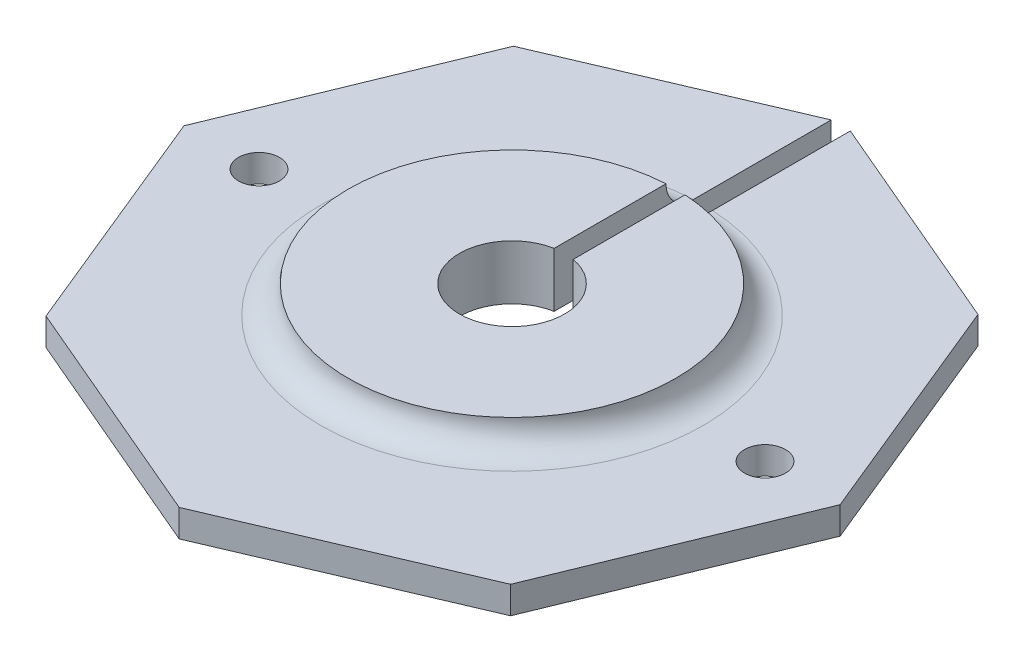
ISO-10303-21;
HEADER;
FILE_DESCRIPTION(('STEP AP214'),'2;1');
FILE_NAME('part.step','',(''),(''),'','','');
FILE_SCHEMA(('AUTOMOTIVE_DESIGN { 1 0 10303 214 1 1 1 1 }'));
ENDSEC;
DATA;
#1=APPLICATION_CONTEXT('core data for automotive mechanical design processes');
#2=APPLICATION_PROTOCOL_DEFINITION('international standard','automotive_design',2000,#1);
#3=PRODUCT_CONTEXT('',#1,'mechanical');
#4=PRODUCT('Part','Part','',(#3));
#5=PRODUCT_RELATED_PRODUCT_CATEGORY('part','',(#4));
#6=PRODUCT_DEFINITION_FORMATION('','',#4);
#7=PRODUCT_DEFINITION_CONTEXT('part definition',#1,'design');
#8=PRODUCT_DEFINITION('design','',#6,#7);
#9=PRODUCT_DEFINITION_SHAPE('','',#8);
#10=(LENGTH_UNIT() NAMED_UNIT(*) SI_UNIT(.MILLI.,.METRE.));
#11=(NAMED_UNIT(*) PLANE_ANGLE_UNIT() SI_UNIT($,.RADIAN.));
#12=(NAMED_UNIT(*) SI_UNIT($,.STERADIAN.) SOLID_ANGLE_UNIT());
#13=UNCERTAINTY_MEASURE_WITH_UNIT(LENGTH_MEASURE(1.E-05),#10,'distance_accuracy_value','');
#14=(GEOMETRIC_REPRESENTATION_CONTEXT(3) GLOBAL_UNCERTAINTY_ASSIGNED_CONTEXT((#13)) GLOBAL_UNIT_ASSIGNED_CONTEXT((#10,
#11,#12)) REPRESENTATION_CONTEXT('',''));
#15=CARTESIAN_POINT('',(0.,0.,0.));
#16=DIRECTION('',(0.,0.,1.));
#17=DIRECTION('',(1.,0.,0.));
#18=AXIS2_PLACEMENT_3D('',#15,#16,#17);
#19=CARTESIAN_POINT('',(17.0154623051134,2.,17.1176203244253));
#20=DIRECTION('',(-0.925276774293261,0.,-0.379292619165543));
#21=DIRECTION('',(-0.379292619165543,0.,0.925276774293261));
#22=AXIS2_PLACEMENT_3D('',#19,#20,#21);
#23=PLANE('',#22);
#24=DIRECTION('',(0.379292619165543,0.,-0.925276774293261));
#25=VECTOR('',#24,1.);
#26=CARTESIAN_POINT('',(17.0154623051134,0.,17.1176203244253));
#27=LINE('',#26,#25);
#28=CARTESIAN_POINT('',(17.0154623051134,0.,17.1176203244253));
#29=VERTEX_POINT('',#28);
#30=CARTESIAN_POINT('',(24.032375759676,0.,0.));
#31=VERTEX_POINT('',#30);
#32=EDGE_CURVE('E264',#29,#31,#27,.T.);
#33=ORIENTED_EDGE('',*,*,#32,.T.);
#34=DIRECTION('',(0.,-1.,0.));
#35=VECTOR('',#34,1.);
#36=CARTESIAN_POINT('',(24.032375759676,2.,0.));
#37=LINE('',#36,#35);
#38=CARTESIAN_POINT('',(24.032375759676,2.,0.));
#39=VERTEX_POINT('',#38);
#40=EDGE_CURVE('E196',#39,#31,#37,.T.);
#41=ORIENTED_EDGE('',*,*,#40,.F.);
#42=DIRECTION('',(0.379292619165543,0.,-0.925276774293261));
#43=VECTOR('',#42,1.);
#44=CARTESIAN_POINT('',(17.0154623051134,2.,17.1176203244253));
#45=LINE('',#44,#43);
#46=CARTESIAN_POINT('',(17.0154623051134,2.,17.1176203244253));
#47=VERTEX_POINT('',#46);
#48=EDGE_CURVE('E177',#47,#39,#45,.T.);
#49=ORIENTED_EDGE('',*,*,#48,.F.);
#50=DIRECTION('',(0.,-1.,0.));
#51=VECTOR('',#50,1.);
#52=CARTESIAN_POINT('',(17.0154623051134,2.,17.1176203244253));
#53=LINE('',#52,#51);
#54=EDGE_CURVE('E178',#47,#29,#53,.T.);
#55=ORIENTED_EDGE('',*,*,#54,.T.);
#56=EDGE_LOOP('',(#33,#41,#49,#55));
#57=FACE_BOUND('',#56,.T.);
#58=ADVANCED_FACE('F37',(#57),#23,.F.);
#59=CARTESIAN_POINT('',(24.032375759676,2.,0.));
#60=DIRECTION('',(-0.925276774293261,0.,0.379292619165543));
#61=DIRECTION('',(0.379292619165543,0.,0.925276774293261));
#62=AXIS2_PLACEMENT_3D('',#59,#60,#61);
#63=PLANE('',#62);
#64=DIRECTION('',(-0.379292619165543,0.,-0.925276774293261));
#65=VECTOR('',#64,1.);
#66=CARTESIAN_POINT('',(24.032375759676,0.,0.));
#67=LINE('',#66,#65);
#68=CARTESIAN_POINT('',(17.0154623051134,0.,-17.1176203244253));
#69=VERTEX_POINT('',#68);
#70=EDGE_CURVE('E168',#31,#69,#67,.T.);
#71=ORIENTED_EDGE('',*,*,#70,.T.);
#72=DIRECTION('',(0.,-1.,0.));
#73=VECTOR('',#72,1.);
#74=CARTESIAN_POINT('',(17.0154623051134,2.,-17.1176203244253));
#75=LINE('',#74,#73);
#76=CARTESIAN_POINT('',(17.0154623051134,2.,-17.1176203244253));
#77=VERTEX_POINT('',#76);
#78=EDGE_CURVE('E193',#77,#69,#75,.T.);
#79=ORIENTED_EDGE('',*,*,#78,.F.);
#80=DIRECTION('',(-0.379292619165543,0.,-0.925276774293261));
#81=VECTOR('',#80,1.);
#82=CARTESIAN_POINT('',(24.032375759676,2.,0.));
#83=LINE('',#82,#81);
#84=EDGE_CURVE('E285',#39,#77,#83,.T.);
#85=ORIENTED_EDGE('',*,*,#84,.F.);
#86=ORIENTED_EDGE('',*,*,#40,.T.);
#87=EDGE_LOOP('',(#71,#79,#85,#86));
#88=FACE_BOUND('',#87,.T.);
#89=ADVANCED_FACE('F253',(#88),#63,.F.);
#90=CARTESIAN_POINT('',(0.,2.,-24.3787526426842));
#91=DIRECTION('',(-0.392493638824803,0.,0.919754719195321));
#92=DIRECTION('',(0.919754719195322,0.,0.392493638824804));
#93=AXIS2_PLACEMENT_3D('',#90,#91,#92);
#94=PLANE('',#93);
#95=DIRECTION('',(-0.919754719195321,0.,-0.392493638824803));
#96=VECTOR('',#95,1.);
#97=CARTESIAN_POINT('',(0.,0.,-24.3787526426842));
#98=LINE('',#97,#96);
#99=CARTESIAN_POINT('',(0.699999999999999,0.,-24.0800365377886));
#100=VERTEX_POINT('',#99);
#101=EDGE_CURVE('E163',#69,#100,#98,.T.);
#102=ORIENTED_EDGE('',*,*,#101,.T.);
#103=DIRECTION('',(0.,1.,0.));
#104=VECTOR('',#103,1.);
#105=CARTESIAN_POINT('',(0.699999999999999,0.,-24.0800365377886));
#106=LINE('',#105,#104);
#107=CARTESIAN_POINT('',(0.699999999999999,2.,-24.0800365377886));
#108=VERTEX_POINT('',#107);
#109=EDGE_CURVE('E156',#100,#108,#106,.T.);
#110=ORIENTED_EDGE('',*,*,#109,.T.);
#111=DIRECTION('',(-0.919754719195321,0.,-0.392493638824803));
#112=VECTOR('',#111,1.);
#113=CARTESIAN_POINT('',(0.,2.,-24.3787526426842));
#114=LINE('',#113,#112);
#115=EDGE_CURVE('E282',#77,#108,#114,.T.);
#116=ORIENTED_EDGE('',*,*,#115,.F.);
#117=ORIENTED_EDGE('',*,*,#78,.T.);
#118=EDGE_LOOP('',(#102,#110,#116,#117));
#119=FACE_BOUND('',#118,.T.);
#120=ADVANCED_FACE('F250',(#119),#94,.F.);
#121=CARTESIAN_POINT('',(0.,2.,-24.3787526426842));
#122=DIRECTION('',(0.392493638824804,0.,0.919754719195321));
#123=DIRECTION('',(0.919754719195321,0.,-0.392493638824804));
#124=AXIS2_PLACEMENT_3D('',#121,#122,#123);
#125=PLANE('',#124);
#126=DIRECTION('',(-0.919754719195322,0.,0.392493638824804));
#127=VECTOR('',#126,1.);
#128=CARTESIAN_POINT('',(0.,2.,-24.3787526426842));
#129=LINE('',#128,#127);
#130=CARTESIAN_POINT('',(-0.7,2.,-24.0800365377886));
#131=VERTEX_POINT('',#130);
#132=CARTESIAN_POINT('',(-17.0154623051134,2.,-17.1176203244253));
#133=VERTEX_POINT('',#132);
#134=EDGE_CURVE('E155',#131,#133,#129,.T.);
#135=ORIENTED_EDGE('',*,*,#134,.F.);
#136=DIRECTION('',(0.,1.,0.));
#137=VECTOR('',#136,1.);
#138=CARTESIAN_POINT('',(-0.7,0.,-24.0800365377886));
#139=LINE('',#138,#137);
#140=CARTESIAN_POINT('',(-0.7,0.,-24.0800365377886));
#141=VERTEX_POINT('',#140);
#142=EDGE_CURVE('E139',#141,#131,#139,.T.);
#143=ORIENTED_EDGE('',*,*,#142,.F.);
#144=DIRECTION('',(-0.919754719195322,0.,0.392493638824804));
#145=VECTOR('',#144,1.);
#146=CARTESIAN_POINT('',(0.,0.,-24.3787526426842));
#147=LINE('',#146,#145);
#148=CARTESIAN_POINT('',(-17.0154623051134,0.,-17.1176203244253));
#149=VERTEX_POINT('',#148);
#150=EDGE_CURVE('E153',#141,#149,#147,.T.);
#151=ORIENTED_EDGE('',*,*,#150,.T.);
#152=DIRECTION('',(0.,-1.,0.));
#153=VECTOR('',#152,1.);
#154=CARTESIAN_POINT('',(-17.0154623051134,2.,-17.1176203244253));
#155=LINE('',#154,#153);
#156=EDGE_CURVE('E191',#133,#149,#155,.T.);
#157=ORIENTED_EDGE('',*,*,#156,.F.);
#158=EDGE_LOOP('',(#135,#143,#151,#157));
#159=FACE_BOUND('',#158,.T.);
#160=ADVANCED_FACE('F151',(#159),#125,.F.);
#161=CARTESIAN_POINT('',(-17.0154623051134,2.,-17.1176203244253));
#162=DIRECTION('',(0.925276774293261,0.,0.379292619165543));
#163=DIRECTION('',(0.379292619165543,0.,-0.925276774293261));
#164=AXIS2_PLACEMENT_3D('',#161,#162,#163);
#165=PLANE('',#164);
#166=DIRECTION('',(-0.379292619165542,0.,0.925276774293261));
#167=VECTOR('',#166,1.);
#168=CARTESIAN_POINT('',(-17.0154623051134,0.,-17.1176203244253));
#169=LINE('',#168,#167);
#170=CARTESIAN_POINT('',(-24.032375759676,0.,0.));
#171=VERTEX_POINT('',#170);
#172=EDGE_CURVE('E162',#149,#171,#169,.T.);
#173=ORIENTED_EDGE('',*,*,#172,.T.);
#174=DIRECTION('',(0.,-1.,0.));
#175=VECTOR('',#174,1.);
#176=CARTESIAN_POINT('',(-24.032375759676,2.,0.));
#177=LINE('',#176,#175);
#178=CARTESIAN_POINT('',(-24.032375759676,2.,0.));
#179=VERTEX_POINT('',#178);
#180=EDGE_CURVE('E188',#179,#171,#177,.T.);
#181=ORIENTED_EDGE('',*,*,#180,.F.);
#182=DIRECTION('',(-0.379292619165542,0.,0.925276774293261));
#183=VECTOR('',#182,1.);
#184=CARTESIAN_POINT('',(-17.0154623051134,2.,-17.1176203244253));
#185=LINE('',#184,#183);
#186=EDGE_CURVE('E279',#133,#179,#185,.T.);
#187=ORIENTED_EDGE('',*,*,#186,.F.);
#188=ORIENTED_EDGE('',*,*,#156,.T.);
#189=EDGE_LOOP('',(#173,#181,#187,#188));
#190=FACE_BOUND('',#189,.T.);
#191=ADVANCED_FACE('F243',(#190),#165,.F.);
#192=CARTESIAN_POINT('',(-24.032375759676,2.,0.));
#193=DIRECTION('',(0.925276774293261,0.,-0.379292619165543));
#194=DIRECTION('',(-0.379292619165543,0.,-0.925276774293261));
#195=AXIS2_PLACEMENT_3D('',#192,#193,#194);
#196=PLANE('',#195);
#197=DIRECTION('',(0.379292619165543,0.,0.925276774293261));
#198=VECTOR('',#197,1.);
#199=CARTESIAN_POINT('',(-24.032375759676,0.,0.));
#200=LINE('',#199,#198);
#201=CARTESIAN_POINT('',(-17.0154623051134,0.,17.1176203244253));
#202=VERTEX_POINT('',#201);
#203=EDGE_CURVE('E165',#171,#202,#200,.T.);
#204=ORIENTED_EDGE('',*,*,#203,.T.);
#205=DIRECTION('',(0.,-1.,0.));
#206=VECTOR('',#205,1.);
#207=CARTESIAN_POINT('',(-17.0154623051134,2.,17.1176203244253));
#208=LINE('',#207,#206);
#209=CARTESIAN_POINT('',(-17.0154623051134,2.,17.1176203244253));
#210=VERTEX_POINT('',#209);
#211=EDGE_CURVE('E185',#210,#202,#208,.T.);
#212=ORIENTED_EDGE('',*,*,#211,.F.);
#213=DIRECTION('',(0.379292619165543,0.,0.925276774293261));
#214=VECTOR('',#213,1.);
#215=CARTESIAN_POINT('',(-24.032375759676,2.,0.));
#216=LINE('',#215,#214);
#217=EDGE_CURVE('E277',#179,#210,#216,.T.);
#218=ORIENTED_EDGE('',*,*,#217,.F.);
#219=ORIENTED_EDGE('',*,*,#180,.T.);
#220=EDGE_LOOP('',(#204,#212,#218,#219));
#221=FACE_BOUND('',#220,.T.);
#222=ADVANCED_FACE('F239',(#221),#196,.F.);
#223=CARTESIAN_POINT('',(-17.0154623051134,2.,17.1176203244253));
#224=DIRECTION('',(0.392493638824804,0.,-0.919754719195321));
#225=DIRECTION('',(-0.919754719195321,0.,-0.392493638824804));
#226=AXIS2_PLACEMENT_3D('',#223,#224,#225);
#227=PLANE('',#226);
#228=DIRECTION('',(0.919754719195321,0.,0.392493638824804));
#229=VECTOR('',#228,1.);
#230=CARTESIAN_POINT('',(-17.0154623051134,0.,17.1176203244253));
#231=LINE('',#230,#229);
#232=CARTESIAN_POINT('',(0.,0.,24.3787526426842));
#233=VERTEX_POINT('',#232);
#234=EDGE_CURVE('E173',#202,#233,#231,.T.);
#235=ORIENTED_EDGE('',*,*,#234,.T.);
#236=DIRECTION('',(0.,-1.,0.));
#237=VECTOR('',#236,1.);
#238=CARTESIAN_POINT('',(0.,2.,24.3787526426842));
#239=LINE('',#238,#237);
#240=CARTESIAN_POINT('',(0.,2.,24.3787526426842));
#241=VERTEX_POINT('',#240);
#242=EDGE_CURVE('E181',#241,#233,#239,.T.);
#243=ORIENTED_EDGE('',*,*,#242,.F.);
#244=DIRECTION('',(0.919754719195321,0.,0.392493638824804));
#245=VECTOR('',#244,1.);
#246=CARTESIAN_POINT('',(-17.0154623051134,2.,17.1176203244253));
#247=LINE('',#246,#245);
#248=EDGE_CURVE('E275',#210,#241,#247,.T.);
#249=ORIENTED_EDGE('',*,*,#248,.F.);
#250=ORIENTED_EDGE('',*,*,#211,.T.);
#251=EDGE_LOOP('',(#235,#243,#249,#250));
#252=FACE_BOUND('',#251,.T.);
#253=ADVANCED_FACE('F235',(#252),#227,.F.);
#254=CARTESIAN_POINT('',(0.,2.,24.3787526426842));
#255=DIRECTION('',(-0.392493638824804,0.,-0.919754719195321));
#256=DIRECTION('',(-0.919754719195322,0.,0.392493638824804));
#257=AXIS2_PLACEMENT_3D('',#254,#255,#256);
#258=PLANE('',#257);
#259=DIRECTION('',(0.919754719195322,0.,-0.392493638824804));
#260=VECTOR('',#259,1.);
#261=CARTESIAN_POINT('',(0.,0.,24.3787526426842));
#262=LINE('',#261,#260);
#263=EDGE_CURVE('E175',#233,#29,#262,.T.);
#264=ORIENTED_EDGE('',*,*,#263,.T.);
#265=ORIENTED_EDGE('',*,*,#54,.F.);
#266=DIRECTION('',(0.919754719195322,0.,-0.392493638824804));
#267=VECTOR('',#266,1.);
#268=CARTESIAN_POINT('',(0.,2.,24.3787526426842));
#269=LINE('',#268,#267);
#270=EDGE_CURVE('E182',#241,#47,#269,.T.);
#271=ORIENTED_EDGE('',*,*,#270,.F.);
#272=ORIENTED_EDGE('',*,*,#242,.T.);
#273=EDGE_LOOP('',(#264,#265,#271,#272));
#274=FACE_BOUND('',#273,.T.);
#275=ADVANCED_FACE('F228',(#274),#258,.F.);
#276=CARTESIAN_POINT('',(0.,2.,0.));
#277=DIRECTION('',(0.,-1.,0.));
#278=DIRECTION('',(0.,0.,-1.));
#279=AXIS2_PLACEMENT_3D('',#276,#277,#278);
#280=PLANE('',#279);
#281=CARTESIAN_POINT('',(-18.532375759676,2.,0.));
#282=DIRECTION('',(0.,1.,0.));
#283=DIRECTION('',(0.,0.,1.));
#284=AXIS2_PLACEMENT_3D('',#281,#282,#283);
#285=CIRCLE('',#284,1.5);
#286=CARTESIAN_POINT('',(-18.532375759676,2.,1.5));
#287=VERTEX_POINT('',#286);
#288=EDGE_CURVE('E310',#287,#287,#285,.T.);
#289=ORIENTED_EDGE('',*,*,#288,.F.);
#290=EDGE_LOOP('',(#289));
#291=FACE_BOUND('',#290,.T.);
#292=CARTESIAN_POINT('',(18.532375759676,2.,0.));
#293=DIRECTION('',(0.,1.,0.));
#294=DIRECTION('',(0.,0.,1.));
#295=AXIS2_PLACEMENT_3D('',#292,#293,#294);
#296=CIRCLE('',#295,1.5);
#297=CARTESIAN_POINT('',(18.532375759676,2.,1.5));
#298=VERTEX_POINT('',#297);
#299=EDGE_CURVE('E307',#298,#298,#296,.T.);
#300=ORIENTED_EDGE('',*,*,#299,.F.);
#301=EDGE_LOOP('',(#300));
#302=FACE_BOUND('',#301,.T.);
#303=DIRECTION('',(0.,0.,1.));
#304=VECTOR('',#303,1.);
#305=CARTESIAN_POINT('',(0.7,2.,0.));
#306=LINE('',#305,#304);
#307=CARTESIAN_POINT('',(0.7,2.,-13.9824890488067));
#308=VERTEX_POINT('',#307);
#309=EDGE_CURVE('E293',#108,#308,#306,.T.);
#310=ORIENTED_EDGE('',*,*,#309,.T.);
#311=CARTESIAN_POINT('',(0.,2.,0.));
#312=DIRECTION('',(0.,-1.,0.));
#313=DIRECTION('',(0.,0.,-1.));
#314=AXIS2_PLACEMENT_3D('',#311,#312,#313);
#315=CIRCLE('',#314,14.);
#316=CARTESIAN_POINT('',(-0.7,2.,-13.9824890488067));
#317=VERTEX_POINT('',#316);
#318=EDGE_CURVE('E58',#308,#317,#315,.T.);
#319=ORIENTED_EDGE('',*,*,#318,.T.);
#320=DIRECTION('',(0.,0.,-1.));
#321=VECTOR('',#320,1.);
#322=CARTESIAN_POINT('',(-0.7,2.,0.));
#323=LINE('',#322,#321);
#324=EDGE_CURVE('E295',#317,#131,#323,.T.);
#325=ORIENTED_EDGE('',*,*,#324,.T.);
#326=ORIENTED_EDGE('',*,*,#134,.T.);
#327=ORIENTED_EDGE('',*,*,#186,.T.);
#328=ORIENTED_EDGE('',*,*,#217,.T.);
#329=ORIENTED_EDGE('',*,*,#248,.T.);
#330=ORIENTED_EDGE('',*,*,#270,.T.);
#331=ORIENTED_EDGE('',*,*,#48,.T.);
#332=ORIENTED_EDGE('',*,*,#84,.T.);
#333=ORIENTED_EDGE('',*,*,#115,.T.);
#334=EDGE_LOOP('',(#310,#319,#325,#326,#327,#328,#329,#330,#331,#332,#333));
#335=FACE_BOUND('',#334,.T.);
#336=ADVANCED_FACE('F225',(#291,#302,#335),#280,.F.);
#337=CARTESIAN_POINT('',(0.,0.,0.));
#338=DIRECTION('',(0.,-1.,0.));
#339=DIRECTION('',(0.,0.,-1.));
#340=AXIS2_PLACEMENT_3D('',#337,#338,#339);
#341=PLANE('',#340);
#342=CARTESIAN_POINT('',(-18.532375759676,0.,0.));
#343=DIRECTION('',(0.,1.,0.));
#344=DIRECTION('',(0.,0.,1.));
#345=AXIS2_PLACEMENT_3D('',#342,#343,#344);
#346=CIRCLE('',#345,1.5);
#347=CARTESIAN_POINT('',(-18.532375759676,0.,1.5));
#348=VERTEX_POINT('',#347);
#349=EDGE_CURVE('E302',#348,#348,#346,.T.);
#350=ORIENTED_EDGE('',*,*,#349,.T.);
#351=EDGE_LOOP('',(#350));
#352=FACE_BOUND('',#351,.T.);
#353=CARTESIAN_POINT('',(18.532375759676,0.,0.));
#354=DIRECTION('',(0.,1.,0.));
#355=DIRECTION('',(0.,0.,1.));
#356=AXIS2_PLACEMENT_3D('',#353,#354,#355);
#357=CIRCLE('',#356,1.5);
#358=CARTESIAN_POINT('',(18.532375759676,0.,1.5));
#359=VERTEX_POINT('',#358);
#360=EDGE_CURVE('E304',#359,#359,#357,.T.);
#361=ORIENTED_EDGE('',*,*,#360,.T.);
#362=EDGE_LOOP('',(#361));
#363=FACE_BOUND('',#362,.T.);
#364=DIRECTION('',(0.,0.,-1.));
#365=VECTOR('',#364,1.);
#366=CARTESIAN_POINT('',(0.7,0.,0.));
#367=LINE('',#366,#365);
#368=CARTESIAN_POINT('',(0.7,0.,-3.78582883923719));
#369=VERTEX_POINT('',#368);
#370=EDGE_CURVE('E147',#369,#100,#367,.T.);
#371=ORIENTED_EDGE('',*,*,#370,.T.);
#372=ORIENTED_EDGE('',*,*,#101,.F.);
#373=ORIENTED_EDGE('',*,*,#70,.F.);
#374=ORIENTED_EDGE('',*,*,#32,.F.);
#375=ORIENTED_EDGE('',*,*,#263,.F.);
#376=ORIENTED_EDGE('',*,*,#234,.F.);
#377=ORIENTED_EDGE('',*,*,#203,.F.);
#378=ORIENTED_EDGE('',*,*,#172,.F.);
#379=ORIENTED_EDGE('',*,*,#150,.F.);
#380=DIRECTION('',(0.,0.,1.));
#381=VECTOR('',#380,1.);
#382=CARTESIAN_POINT('',(-0.7,0.,0.));
#383=LINE('',#382,#381);
#384=CARTESIAN_POINT('',(-0.7,0.,-3.78582883923719));
#385=VERTEX_POINT('',#384);
#386=EDGE_CURVE('E136',#141,#385,#383,.T.);
#387=ORIENTED_EDGE('',*,*,#386,.T.);
#388=CARTESIAN_POINT('',(0.,0.,0.));
#389=DIRECTION('',(0.,-1.,0.));
#390=DIRECTION('',(0.,0.,-1.));
#391=AXIS2_PLACEMENT_3D('',#388,#389,#390);
#392=CIRCLE('',#391,3.85);
#393=EDGE_CURVE('E271',#369,#385,#392,.T.);
#394=ORIENTED_EDGE('',*,*,#393,.F.);
#395=EDGE_LOOP('',(#371,#372,#373,#374,#375,#376,#377,#378,#379,#387,#394));
#396=FACE_BOUND('',#395,.T.);
#397=ADVANCED_FACE('F160',(#352,#363,#396),#341,.T.);
#398=CARTESIAN_POINT('',(0.,4.,0.));
#399=DIRECTION('',(0.,1.,0.));
#400=DIRECTION('',(0.,0.,1.));
#401=AXIS2_PLACEMENT_3D('',#398,#399,#400);
#402=PLANE('',#401);
#403=DIRECTION('',(0.,0.,-1.));
#404=VECTOR('',#403,1.);
#405=CARTESIAN_POINT('',(0.7,4.,0.));
#406=LINE('',#405,#404);
#407=CARTESIAN_POINT('',(0.7,4.,-3.78582883923719));
#408=VERTEX_POINT('',#407);
#409=CARTESIAN_POINT('',(0.7,4.,-11.9795659353751));
#410=VERTEX_POINT('',#409);
#411=EDGE_CURVE('E148',#408,#410,#406,.T.);
#412=ORIENTED_EDGE('',*,*,#411,.F.);
#413=CARTESIAN_POINT('',(0.,4.,0.));
#414=DIRECTION('',(0.,1.,0.));
#415=DIRECTION('',(0.,0.,1.));
#416=AXIS2_PLACEMENT_3D('',#413,#414,#415);
#417=CIRCLE('',#416,3.85);
#418=CARTESIAN_POINT('',(-0.7,4.,-3.78582883923719));
#419=VERTEX_POINT('',#418);
#420=EDGE_CURVE('E290',#419,#408,#417,.T.);
#421=ORIENTED_EDGE('',*,*,#420,.F.);
#422=DIRECTION('',(0.,0.,1.));
#423=VECTOR('',#422,1.);
#424=CARTESIAN_POINT('',(-0.7,4.,0.));
#425=LINE('',#424,#423);
#426=CARTESIAN_POINT('',(-0.7,4.,-11.9795659353751));
#427=VERTEX_POINT('',#426);
#428=EDGE_CURVE('E300',#427,#419,#425,.T.);
#429=ORIENTED_EDGE('',*,*,#428,.F.);
#430=CARTESIAN_POINT('',(0.,4.,0.));
#431=DIRECTION('',(0.,1.,0.));
#432=DIRECTION('',(0.,0.,1.));
#433=AXIS2_PLACEMENT_3D('',#430,#431,#432);
#434=CIRCLE('',#433,12.);
#435=EDGE_CURVE('E268',#427,#410,#434,.T.);
#436=ORIENTED_EDGE('',*,*,#435,.T.);
#437=EDGE_LOOP('',(#412,#421,#429,#436));
#438=FACE_BOUND('',#437,.T.);
#439=ADVANCED_FACE('F220',(#438),#402,.T.);
#440=CARTESIAN_POINT('',(0.,-21.,0.));
#441=DIRECTION('',(0.,1.,0.));
#442=DIRECTION('',(0.,0.,1.));
#443=AXIS2_PLACEMENT_3D('',#440,#441,#442);
#444=CYLINDRICAL_SURFACE('',#443,3.85);
#445=ORIENTED_EDGE('',*,*,#420,.T.);
#446=DIRECTION('',(0.,1.,0.));
#447=VECTOR('',#446,1.);
#448=CARTESIAN_POINT('',(0.7,-21.,-3.78582883923719));
#449=LINE('',#448,#447);
#450=EDGE_CURVE('E200',#408,#369,#449,.F.);
#451=ORIENTED_EDGE('',*,*,#450,.T.);
#452=ORIENTED_EDGE('',*,*,#393,.T.);
#453=DIRECTION('',(0.,1.,0.));
#454=VECTOR('',#453,1.);
#455=CARTESIAN_POINT('',(-0.7,-21.,-3.78582883923719));
#456=LINE('',#455,#454);
#457=EDGE_CURVE('E142',#385,#419,#456,.T.);
#458=ORIENTED_EDGE('',*,*,#457,.T.);
#459=EDGE_LOOP('',(#445,#451,#452,#458));
#460=FACE_BOUND('',#459,.T.);
#461=ADVANCED_FACE('F217',(#460),#444,.F.);
#462=CARTESIAN_POINT('',(-0.7,0.,0.));
#463=DIRECTION('',(-1.,0.,0.));
#464=DIRECTION('',(0.,0.,1.));
#465=AXIS2_PLACEMENT_3D('',#462,#463,#464);
#466=PLANE('',#465);
#467=ORIENTED_EDGE('',*,*,#324,.F.);
#468=CARTESIAN_POINT('',(-0.7,2.,-13.9824890488067));
#469=CARTESIAN_POINT('',(-0.7,2.00000040914051,-13.9260832904179));
#470=CARTESIAN_POINT('',(-0.7,2.0023817295326,-13.8697045721833));
#471=CARTESIAN_POINT('',(-0.7,2.01188158373758,-13.757350417571));
#472=CARTESIAN_POINT('',(-0.7,2.01899989420897,-13.7013749623058));
#473=CARTESIAN_POINT('',(-0.7,2.04739302873454,-13.534749470041));
#474=CARTESIAN_POINT('',(-0.7,2.07570624076798,-13.4252152430966));
#475=CARTESIAN_POINT('',(-0.7,2.15031931455586,-13.2124572609037));
#476=CARTESIAN_POINT('',(-0.7,2.19662788647979,-13.109236589607));
#477=CARTESIAN_POINT('',(-0.7,2.3059185520359,-12.9120421798185));
#478=CARTESIAN_POINT('',(-0.7,2.36889760871739,-12.818066761343));
#479=CARTESIAN_POINT('',(-0.7,2.50972163363617,-12.6420747100509));
#480=CARTESIAN_POINT('',(-0.7,2.58756053539775,-12.5600532211011));
#481=CARTESIAN_POINT('',(-0.7,2.75593859159255,-12.4102455154759));
#482=CARTESIAN_POINT('',(-0.7,2.84648018311833,-12.3424620367005));
#483=CARTESIAN_POINT('',(-0.7,3.03756097734581,-12.2231642078415));
#484=CARTESIAN_POINT('',(-0.7,3.1380889373474,-12.1716318291305));
#485=CARTESIAN_POINT('',(-0.7,3.34635826989968,-12.0862326728402));
#486=CARTESIAN_POINT('',(-0.7,3.4540952026677,-12.0523551331535));
#487=CARTESIAN_POINT('',(-0.7,3.6354238330878,-12.0117600362176));
#488=CARTESIAN_POINT('',(-0.7,3.70786313642942,-11.9996946052997));
#489=CARTESIAN_POINT('',(-0.7,3.85352469563705,-11.9835986709332));
#490=CARTESIAN_POINT('',(-0.7,3.92674569511266,-11.9795567941036));
#491=CARTESIAN_POINT('',(-0.7,4.,-11.9795659353751));
#492=B_SPLINE_CURVE_WITH_KNOTS('',3,(#468,#469,#470,#471,#472,#473,#474,#475,#476,#477,#478,
#479,#480,#481,#482,#483,#484,#485,#486,#487,#488,#489,#490,#491),.UNSPECIFIED.,.F.,.F.,(4,2,2,
2,2,2,2,2,2,2,2,4),(0.,0.169113323933751,0.338218675010055,0.675881250668948,1.01370746678792,
1.35147218161793,1.68909929901875,2.02679128115612,2.36410730620754,2.70121746757619,
2.92111603944138,3.14070268205558),.UNSPECIFIED.);
#493=EDGE_CURVE('E11',#317,#427,#492,.T.);
#494=ORIENTED_EDGE('',*,*,#493,.T.);
#495=ORIENTED_EDGE('',*,*,#428,.T.);
#496=ORIENTED_EDGE('',*,*,#457,.F.);
#497=ORIENTED_EDGE('',*,*,#386,.F.);
#498=ORIENTED_EDGE('',*,*,#142,.T.);
#499=EDGE_LOOP('',(#467,#494,#495,#496,#497,#498));
#500=FACE_BOUND('',#499,.T.);
#501=ADVANCED_FACE('F138',(#500),#466,.F.);
#502=CARTESIAN_POINT('',(0.7,0.,0.));
#503=DIRECTION('',(1.,0.,0.));
#504=DIRECTION('',(0.,0.,-1.));
#505=AXIS2_PLACEMENT_3D('',#502,#503,#504);
#506=PLANE('',#505);
#507=ORIENTED_EDGE('',*,*,#109,.F.);
#508=ORIENTED_EDGE('',*,*,#370,.F.);
#509=ORIENTED_EDGE('',*,*,#450,.F.);
#510=ORIENTED_EDGE('',*,*,#411,.T.);
#511=CARTESIAN_POINT('',(0.7,4.,-11.9795659353751));
#512=CARTESIAN_POINT('',(0.7,3.94379680665602,-11.9795662497332));
#513=CARTESIAN_POINT('',(0.7,3.88762056688679,-11.9819405691449));
#514=CARTESIAN_POINT('',(0.7,3.7756706818547,-11.9914122948853));
#515=CARTESIAN_POINT('',(0.7,3.71989701586372,-11.9985094562607));
#516=CARTESIAN_POINT('',(0.7,3.55388259961532,-12.0268160513262));
#517=CARTESIAN_POINT('',(0.7,3.44475485195152,-12.0550407929741));
#518=CARTESIAN_POINT('',(0.7,3.23279140782795,-12.1294061385031));
#519=CARTESIAN_POINT('',(0.7,3.12995863696501,-12.1755550005497));
#520=CARTESIAN_POINT('',(0.7,2.93349329644339,-12.2844435458285));
#521=CARTESIAN_POINT('',(0.7,2.8398592542413,-12.3471805676533));
#522=CARTESIAN_POINT('',(0.7,2.66436307436664,-12.4875149203423));
#523=CARTESIAN_POINT('',(0.7,2.58251057203656,-12.5651242947535));
#524=CARTESIAN_POINT('',(0.7,2.43295475452028,-12.7329825356392));
#525=CARTESIAN_POINT('',(0.7,2.36525426780773,-12.8232339227844));
#526=CARTESIAN_POINT('',(0.7,2.24582631042758,-13.0139581297234));
#527=CARTESIAN_POINT('',(0.7,2.19412685955945,-13.1144484748783));
#528=CARTESIAN_POINT('',(0.7,2.10833672349347,-13.3226563203132));
#529=CARTESIAN_POINT('',(0.7,2.07423601392103,-13.4303696667188));
#530=CARTESIAN_POINT('',(0.7,2.03298926078774,-13.6126871544461));
#531=CARTESIAN_POINT('',(0.7,2.02062609727482,-13.6861536180321));
#532=CARTESIAN_POINT('',(0.7,2.00413244310666,-13.833899536806));
#533=CARTESIAN_POINT('',(0.7,1.99999034189894,-13.9081776962484));
#534=CARTESIAN_POINT('',(0.7,2.,-13.9824890488067));
#535=B_SPLINE_CURVE_WITH_KNOTS('',3,(#511,#512,#513,#514,#515,#516,#517,#518,#519,#520,#521,
#522,#523,#524,#525,#526,#527,#528,#529,#530,#531,#532,#533,#534),.UNSPECIFIED.,.F.,.F.,(4,2,2,
2,2,2,2,2,2,2,2,4),(0.,0.168505921088114,0.337003103186403,0.673424128143096,1.01000033630271,
1.34652257684692,1.68331849167251,2.02018165553971,2.35763141399496,2.69488874580466,
2.91795816453771,3.14071231898037),.UNSPECIFIED.);
#536=EDGE_CURVE('E51',#410,#308,#535,.T.);
#537=ORIENTED_EDGE('',*,*,#536,.T.);
#538=ORIENTED_EDGE('',*,*,#309,.F.);
#539=EDGE_LOOP('',(#507,#508,#509,#510,#537,#538));
#540=FACE_BOUND('',#539,.T.);
#541=ADVANCED_FACE('F208',(#540),#506,.F.);
#542=CARTESIAN_POINT('',(0.,4.,0.));
#543=DIRECTION('',(0.,-1.,0.));
#544=DIRECTION('',(0.,0.,-1.));
#545=AXIS2_PLACEMENT_3D('',#542,#543,#544);
#546=TOROIDAL_SURFACE('',#545,14.,2.);
#547=ORIENTED_EDGE('',*,*,#493,.F.);
#548=ORIENTED_EDGE('',*,*,#318,.F.);
#549=ORIENTED_EDGE('',*,*,#536,.F.);
#550=ORIENTED_EDGE('',*,*,#435,.F.);
#551=EDGE_LOOP('',(#547,#548,#549,#550));
#552=FACE_BOUND('',#551,.T.);
#553=ADVANCED_FACE('F39',(#552),#546,.F.);
#554=CARTESIAN_POINT('',(18.532375759676,0.,0.));
#555=DIRECTION('',(0.,1.,0.));
#556=DIRECTION('',(0.,0.,1.));
#557=AXIS2_PLACEMENT_3D('',#554,#555,#556);
#558=CYLINDRICAL_SURFACE('',#557,1.5);
#559=ORIENTED_EDGE('',*,*,#360,.F.);
#560=EDGE_LOOP('',(#559));
#561=FACE_BOUND('',#560,.T.);
#562=ORIENTED_EDGE('',*,*,#299,.T.);
#563=EDGE_LOOP('',(#562));
#564=FACE_BOUND('',#563,.T.);
#565=ADVANCED_FACE('F212',(#561,#564),#558,.F.);
#566=CARTESIAN_POINT('',(-18.532375759676,0.,0.));
#567=DIRECTION('',(0.,1.,0.));
#568=DIRECTION('',(0.,0.,1.));
#569=AXIS2_PLACEMENT_3D('',#566,#567,#568);
#570=CYLINDRICAL_SURFACE('',#569,1.5);
#571=ORIENTED_EDGE('',*,*,#349,.F.);
#572=EDGE_LOOP('',(#571));
#573=FACE_BOUND('',#572,.T.);
#574=ORIENTED_EDGE('',*,*,#288,.T.);
#575=EDGE_LOOP('',(#574));
#576=FACE_BOUND('',#575,.T.);
#577=ADVANCED_FACE('F317',(#573,#576),#570,.F.);
#578=CLOSED_SHELL('',(#58,#89,#120,#160,#191,#222,#253,#275,#336,#397,#439,#461,#501,#541,#553,
#565,#577));
#579=MANIFOLD_SOLID_BREP('B2',#578);
#580=ADVANCED_BREP_SHAPE_REPRESENTATION('',(#18,#579),#14);
#581=SHAPE_DEFINITION_REPRESENTATION(#9,#580);
ENDSEC;
END-ISO-10303-21;
